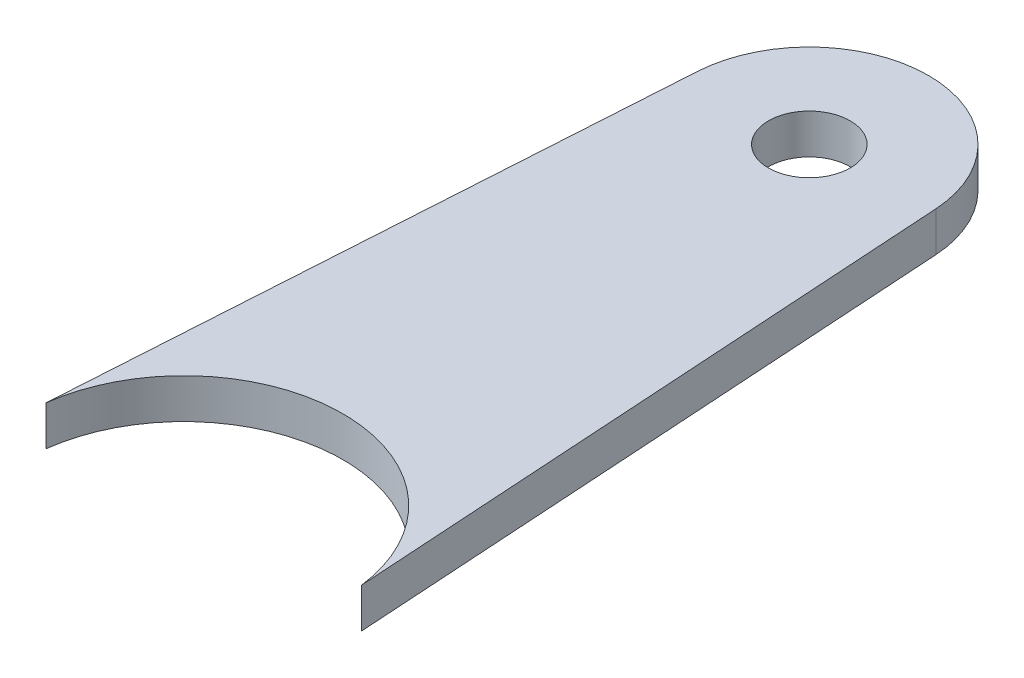
ISO-10303-21;
HEADER;
FILE_DESCRIPTION(('STEP AP214'),'2;1');
FILE_NAME('part.step','',(''),(''),'','','');
FILE_SCHEMA(('AUTOMOTIVE_DESIGN { 1 0 10303 214 1 1 1 1 }'));
ENDSEC;
DATA;
#1=APPLICATION_CONTEXT('core data for automotive mechanical design processes');
#2=APPLICATION_PROTOCOL_DEFINITION('international standard','automotive_design',2000,#1);
#3=PRODUCT_CONTEXT('',#1,'mechanical');
#4=PRODUCT('Part','Part','',(#3));
#5=PRODUCT_RELATED_PRODUCT_CATEGORY('part','',(#4));
#6=PRODUCT_DEFINITION_FORMATION('','',#4);
#7=PRODUCT_DEFINITION_CONTEXT('part definition',#1,'design');
#8=PRODUCT_DEFINITION('design','',#6,#7);
#9=PRODUCT_DEFINITION_SHAPE('','',#8);
#10=(LENGTH_UNIT() NAMED_UNIT(*) SI_UNIT(.MILLI.,.METRE.));
#11=(NAMED_UNIT(*) PLANE_ANGLE_UNIT() SI_UNIT($,.RADIAN.));
#12=(NAMED_UNIT(*) SI_UNIT($,.STERADIAN.) SOLID_ANGLE_UNIT());
#13=UNCERTAINTY_MEASURE_WITH_UNIT(LENGTH_MEASURE(1.E-05),#10,'distance_accuracy_value','');
#14=(GEOMETRIC_REPRESENTATION_CONTEXT(3) GLOBAL_UNCERTAINTY_ASSIGNED_CONTEXT((#13)) GLOBAL_UNIT_ASSIGNED_CONTEXT((#10,
#11,#12)) REPRESENTATION_CONTEXT('',''));
#15=CARTESIAN_POINT('',(0.,0.,0.));
#16=DIRECTION('',(0.,0.,1.));
#17=DIRECTION('',(1.,0.,0.));
#18=AXIS2_PLACEMENT_3D('',#15,#16,#17);
#19=CARTESIAN_POINT('',(12.7,3.175,0.));
#20=DIRECTION('',(0.,-1.,0.));
#21=DIRECTION('',(0.,0.,-1.));
#22=AXIS2_PLACEMENT_3D('',#19,#20,#21);
#23=CYLINDRICAL_SURFACE('',#22,12.7);
#24=CARTESIAN_POINT('',(12.7,0.,0.));
#25=DIRECTION('',(0.,1.,0.));
#26=DIRECTION('',(0.,0.,1.));
#27=AXIS2_PLACEMENT_3D('',#24,#25,#26);
#28=CIRCLE('',#27,12.7);
#29=CARTESIAN_POINT('',(25.298948919587,0.,-1.59890153594173));
#30=VERTEX_POINT('',#29);
#31=CARTESIAN_POINT('',(0.10105108041297,0.,-1.59890153594173));
#32=VERTEX_POINT('',#31);
#33=EDGE_CURVE('E110',#30,#32,#28,.T.);
#34=ORIENTED_EDGE('',*,*,#33,.F.);
#35=DIRECTION('',(0.,-1.,0.));
#36=VECTOR('',#35,1.);
#37=CARTESIAN_POINT('',(25.298948919587,3.175,-1.59890153594173));
#38=LINE('',#37,#36);
#39=CARTESIAN_POINT('',(25.298948919587,3.175,-1.59890153594173));
#40=VERTEX_POINT('',#39);
#41=EDGE_CURVE('E11',#40,#30,#38,.T.);
#42=ORIENTED_EDGE('',*,*,#41,.F.);
#43=CARTESIAN_POINT('',(12.7,3.175,0.));
#44=DIRECTION('',(0.,1.,0.));
#45=DIRECTION('',(0.,0.,1.));
#46=AXIS2_PLACEMENT_3D('',#43,#44,#45);
#47=CIRCLE('',#46,12.7);
#48=CARTESIAN_POINT('',(0.10105108041297,3.175,-1.59890153594173));
#49=VERTEX_POINT('',#48);
#50=EDGE_CURVE('E92',#40,#49,#47,.T.);
#51=ORIENTED_EDGE('',*,*,#50,.T.);
#52=DIRECTION('',(0.,-1.,0.));
#53=VECTOR('',#52,1.);
#54=CARTESIAN_POINT('',(0.10105108041297,3.175,-1.59890153594173));
#55=LINE('',#54,#53);
#56=EDGE_CURVE('E59',#49,#32,#55,.T.);
#57=ORIENTED_EDGE('',*,*,#56,.T.);
#58=EDGE_LOOP('',(#34,#42,#51,#57));
#59=FACE_BOUND('',#58,.T.);
#60=ADVANCED_FACE('F43',(#59),#23,.F.);
#61=CARTESIAN_POINT('',(25.298948919587,3.175,-1.59890153594172));
#62=DIRECTION('',(-0.99800882311098,0.,0.0630744717983164));
#63=DIRECTION('',(0.0630744717983164,0.,0.99800882311098));
#64=AXIS2_PLACEMENT_3D('',#61,#62,#63);
#65=PLANE('',#64);
#66=DIRECTION('',(-0.0630744717983164,0.,-0.99800882311098));
#67=VECTOR('',#66,1.);
#68=CARTESIAN_POINT('',(25.298948919587,0.,-1.59890153594172));
#69=LINE('',#68,#67);
#70=CARTESIAN_POINT('',(22.2060340401321,0.,-50.537184343879));
#71=VERTEX_POINT('',#70);
#72=EDGE_CURVE('E98',#30,#71,#69,.T.);
#73=ORIENTED_EDGE('',*,*,#72,.T.);
#74=DIRECTION('',(0.,-1.,0.));
#75=VECTOR('',#74,1.);
#76=CARTESIAN_POINT('',(22.2060340401321,3.175,-50.537184343879));
#77=LINE('',#76,#75);
#78=CARTESIAN_POINT('',(22.2060340401321,3.175,-50.537184343879));
#79=VERTEX_POINT('',#78);
#80=EDGE_CURVE('E51',#79,#71,#77,.T.);
#81=ORIENTED_EDGE('',*,*,#80,.F.);
#82=DIRECTION('',(-0.0630744717983164,0.,-0.99800882311098));
#83=VECTOR('',#82,1.);
#84=CARTESIAN_POINT('',(25.298948919587,3.175,-1.59890153594172));
#85=LINE('',#84,#83);
#86=EDGE_CURVE('E85',#40,#79,#85,.T.);
#87=ORIENTED_EDGE('',*,*,#86,.F.);
#88=ORIENTED_EDGE('',*,*,#41,.T.);
#89=EDGE_LOOP('',(#73,#81,#87,#88));
#90=FACE_BOUND('',#89,.T.);
#91=ADVANCED_FACE('F96',(#90),#65,.F.);
#92=CARTESIAN_POINT('',(12.7,3.175,-49.9364));
#93=DIRECTION('',(0.,-1.,0.));
#94=DIRECTION('',(0.,0.,-1.));
#95=AXIS2_PLACEMENT_3D('',#92,#93,#94);
#96=CYLINDRICAL_SURFACE('',#95,9.525);
#97=CARTESIAN_POINT('',(12.7,0.,-49.9364));
#98=DIRECTION('',(0.,1.,0.));
#99=DIRECTION('',(0.,0.,1.));
#100=AXIS2_PLACEMENT_3D('',#97,#98,#99);
#101=CIRCLE('',#100,9.525);
#102=CARTESIAN_POINT('',(3.19396595986791,0.,-50.537184343879));
#103=VERTEX_POINT('',#102);
#104=EDGE_CURVE('E113',#103,#71,#101,.F.);
#105=ORIENTED_EDGE('',*,*,#104,.F.);
#106=DIRECTION('',(0.,-1.,0.));
#107=VECTOR('',#106,1.);
#108=CARTESIAN_POINT('',(3.19396595986791,3.175,-50.537184343879));
#109=LINE('',#108,#107);
#110=CARTESIAN_POINT('',(3.19396595986791,3.175,-50.537184343879));
#111=VERTEX_POINT('',#110);
#112=EDGE_CURVE('E72',#111,#103,#109,.T.);
#113=ORIENTED_EDGE('',*,*,#112,.F.);
#114=CARTESIAN_POINT('',(12.7,3.175,-49.9364));
#115=DIRECTION('',(0.,1.,0.));
#116=DIRECTION('',(0.,0.,1.));
#117=AXIS2_PLACEMENT_3D('',#114,#115,#116);
#118=CIRCLE('',#117,9.525);
#119=EDGE_CURVE('E91',#111,#79,#118,.F.);
#120=ORIENTED_EDGE('',*,*,#119,.T.);
#121=ORIENTED_EDGE('',*,*,#80,.T.);
#122=EDGE_LOOP('',(#105,#113,#120,#121));
#123=FACE_BOUND('',#122,.T.);
#124=ADVANCED_FACE('F101',(#123),#96,.T.);
#125=CARTESIAN_POINT('',(0.,3.175,0.));
#126=DIRECTION('',(-0.99800882311098,0.,-0.0630744717983163));
#127=DIRECTION('',(-0.0630744717983163,0.,0.99800882311098));
#128=AXIS2_PLACEMENT_3D('',#125,#126,#127);
#129=PLANE('',#128);
#130=DIRECTION('',(0.0630744717983163,0.,-0.99800882311098));
#131=VECTOR('',#130,1.);
#132=CARTESIAN_POINT('',(0.,0.,0.));
#133=LINE('',#132,#131);
#134=EDGE_CURVE('E115',#32,#103,#133,.T.);
#135=ORIENTED_EDGE('',*,*,#134,.F.);
#136=ORIENTED_EDGE('',*,*,#56,.F.);
#137=DIRECTION('',(0.0630744717983163,0.,-0.99800882311098));
#138=VECTOR('',#137,1.);
#139=CARTESIAN_POINT('',(0.,3.175,0.));
#140=LINE('',#139,#138);
#141=EDGE_CURVE('E102',#49,#111,#140,.T.);
#142=ORIENTED_EDGE('',*,*,#141,.T.);
#143=ORIENTED_EDGE('',*,*,#112,.T.);
#144=EDGE_LOOP('',(#135,#136,#142,#143));
#145=FACE_BOUND('',#144,.T.);
#146=ADVANCED_FACE('F124',(#145),#129,.T.);
#147=CARTESIAN_POINT('',(12.7,3.175,-49.9364));
#148=DIRECTION('',(0.,-1.,0.));
#149=DIRECTION('',(0.,0.,-1.));
#150=AXIS2_PLACEMENT_3D('',#147,#148,#149);
#151=CYLINDRICAL_SURFACE('',#150,3.2639);
#152=CARTESIAN_POINT('',(12.7,3.175,-49.9364));
#153=DIRECTION('',(0.,1.,0.));
#154=DIRECTION('',(0.,0.,1.));
#155=AXIS2_PLACEMENT_3D('',#152,#153,#154);
#156=CIRCLE('',#155,3.2639);
#157=CARTESIAN_POINT('',(12.7,3.175,-46.6725));
#158=VERTEX_POINT('',#157);
#159=EDGE_CURVE('E104',#158,#158,#156,.T.);
#160=ORIENTED_EDGE('',*,*,#159,.T.);
#161=EDGE_LOOP('',(#160));
#162=FACE_BOUND('',#161,.T.);
#163=CARTESIAN_POINT('',(12.7,0.,-49.9364));
#164=DIRECTION('',(0.,1.,0.));
#165=DIRECTION('',(0.,0.,1.));
#166=AXIS2_PLACEMENT_3D('',#163,#164,#165);
#167=CIRCLE('',#166,3.2639);
#168=CARTESIAN_POINT('',(12.7,0.,-46.6725));
#169=VERTEX_POINT('',#168);
#170=EDGE_CURVE('E118',#169,#169,#167,.T.);
#171=ORIENTED_EDGE('',*,*,#170,.F.);
#172=EDGE_LOOP('',(#171));
#173=FACE_BOUND('',#172,.T.);
#174=ADVANCED_FACE('F126',(#162,#173),#151,.F.);
#175=CARTESIAN_POINT('',(0.,3.175,0.));
#176=DIRECTION('',(0.,1.,0.));
#177=DIRECTION('',(0.,0.,1.));
#178=AXIS2_PLACEMENT_3D('',#175,#176,#177);
#179=PLANE('',#178);
#180=ORIENTED_EDGE('',*,*,#50,.F.);
#181=ORIENTED_EDGE('',*,*,#86,.T.);
#182=ORIENTED_EDGE('',*,*,#119,.F.);
#183=ORIENTED_EDGE('',*,*,#141,.F.);
#184=EDGE_LOOP('',(#180,#181,#182,#183));
#185=FACE_BOUND('',#184,.T.);
#186=ORIENTED_EDGE('',*,*,#159,.F.);
#187=EDGE_LOOP('',(#186));
#188=FACE_BOUND('',#187,.T.);
#189=ADVANCED_FACE('F87',(#185,#188),#179,.T.);
#190=CARTESIAN_POINT('',(0.,0.,0.));
#191=DIRECTION('',(0.,1.,0.));
#192=DIRECTION('',(0.,0.,1.));
#193=AXIS2_PLACEMENT_3D('',#190,#191,#192);
#194=PLANE('',#193);
#195=ORIENTED_EDGE('',*,*,#33,.T.);
#196=ORIENTED_EDGE('',*,*,#134,.T.);
#197=ORIENTED_EDGE('',*,*,#104,.T.);
#198=ORIENTED_EDGE('',*,*,#72,.F.);
#199=EDGE_LOOP('',(#195,#196,#197,#198));
#200=FACE_BOUND('',#199,.T.);
#201=ORIENTED_EDGE('',*,*,#170,.T.);
#202=EDGE_LOOP('',(#201));
#203=FACE_BOUND('',#202,.T.);
#204=ADVANCED_FACE('F166',(#200,#203),#194,.F.);
#205=CLOSED_SHELL('',(#60,#91,#124,#146,#174,#189,#204));
#206=MANIFOLD_SOLID_BREP('B2',#205);
#207=ADVANCED_BREP_SHAPE_REPRESENTATION('',(#18,#206),#14);
#208=SHAPE_DEFINITION_REPRESENTATION(#9,#207);
ENDSEC;
END-ISO-10303-21;
